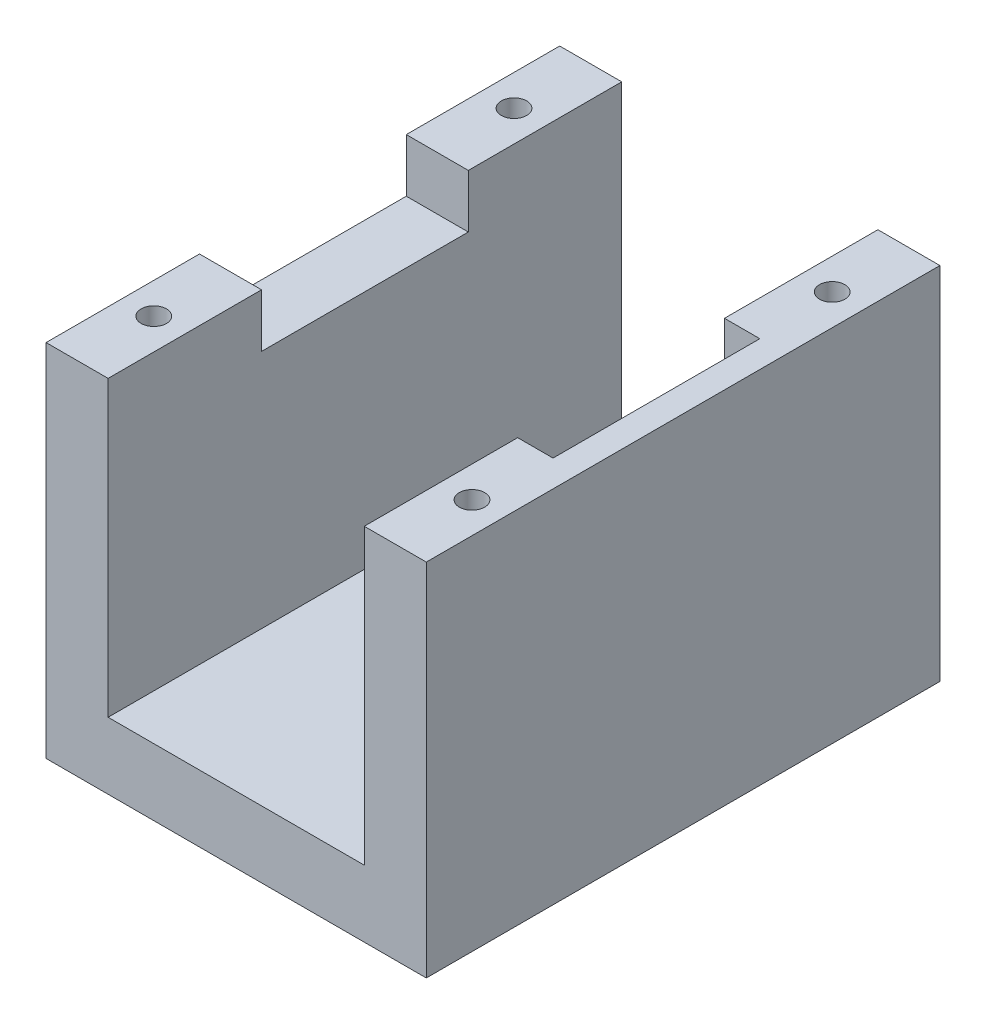
ISO-10303-21;
HEADER;
FILE_DESCRIPTION(('STEP AP214'),'2;1');
FILE_NAME('part.step','',(''),(''),'','','');
FILE_SCHEMA(('AUTOMOTIVE_DESIGN { 1 0 10303 214 1 1 1 1 }'));
ENDSEC;
DATA;
#1=APPLICATION_CONTEXT('core data for automotive mechanical design processes');
#2=APPLICATION_PROTOCOL_DEFINITION('international standard','automotive_design',2000,#1);
#3=PRODUCT_CONTEXT('',#1,'mechanical');
#4=PRODUCT('Part','Part','',(#3));
#5=PRODUCT_RELATED_PRODUCT_CATEGORY('part','',(#4));
#6=PRODUCT_DEFINITION_FORMATION('','',#4);
#7=PRODUCT_DEFINITION_CONTEXT('part definition',#1,'design');
#8=PRODUCT_DEFINITION('design','',#6,#7);
#9=PRODUCT_DEFINITION_SHAPE('','',#8);
#10=(LENGTH_UNIT() NAMED_UNIT(*) SI_UNIT(.MILLI.,.METRE.));
#11=(NAMED_UNIT(*) PLANE_ANGLE_UNIT() SI_UNIT($,.RADIAN.));
#12=(NAMED_UNIT(*) SI_UNIT($,.STERADIAN.) SOLID_ANGLE_UNIT());
#13=UNCERTAINTY_MEASURE_WITH_UNIT(LENGTH_MEASURE(1.E-05),#10,'distance_accuracy_value','');
#14=(GEOMETRIC_REPRESENTATION_CONTEXT(3) GLOBAL_UNCERTAINTY_ASSIGNED_CONTEXT((#13)) GLOBAL_UNIT_ASSIGNED_CONTEXT((#10,
#11,#12)) REPRESENTATION_CONTEXT('',''));
#15=CARTESIAN_POINT('',(0.,0.,0.));
#16=DIRECTION('',(0.,0.,1.));
#17=DIRECTION('',(1.,0.,0.));
#18=AXIS2_PLACEMENT_3D('',#15,#16,#17);
#19=CARTESIAN_POINT('',(0.,44.,0.));
#20=DIRECTION('',(0.,1.,0.));
#21=DIRECTION('',(0.,0.,1.));
#22=AXIS2_PLACEMENT_3D('',#19,#20,#21);
#23=PLANE('',#22);
#24=DIRECTION('',(0.,0.,1.));
#25=VECTOR('',#24,1.);
#26=CARTESIAN_POINT('',(-19.2,44.,38.5));
#27=LINE('',#26,#25);
#28=CARTESIAN_POINT('',(-19.2,44.,15.5));
#29=VERTEX_POINT('',#28);
#30=CARTESIAN_POINT('',(-19.2,44.,38.5));
#31=VERTEX_POINT('',#30);
#32=EDGE_CURVE('E162',#29,#31,#27,.T.);
#33=ORIENTED_EDGE('',*,*,#32,.F.);
#34=DIRECTION('',(1.,0.,0.));
#35=VECTOR('',#34,1.);
#36=CARTESIAN_POINT('',(24.5,44.,15.5));
#37=LINE('',#36,#35);
#38=CARTESIAN_POINT('',(-28.5,44.,15.5));
#39=VERTEX_POINT('',#38);
#40=EDGE_CURVE('E224',#39,#29,#37,.T.);
#41=ORIENTED_EDGE('',*,*,#40,.F.);
#42=DIRECTION('',(0.,0.,1.));
#43=VECTOR('',#42,1.);
#44=CARTESIAN_POINT('',(-28.5,44.,-18.5));
#45=LINE('',#44,#43);
#46=CARTESIAN_POINT('',(-28.5,44.,38.5));
#47=VERTEX_POINT('',#46);
#48=EDGE_CURVE('E171',#39,#47,#45,.T.);
#49=ORIENTED_EDGE('',*,*,#48,.T.);
#50=DIRECTION('',(-1.,0.,0.));
#51=VECTOR('',#50,1.);
#52=CARTESIAN_POINT('',(28.5,44.,38.5));
#53=LINE('',#52,#51);
#54=EDGE_CURVE('E152',#31,#47,#53,.T.);
#55=ORIENTED_EDGE('',*,*,#54,.F.);
#56=EDGE_LOOP('',(#33,#41,#49,#55));
#57=FACE_BOUND('',#56,.T.);
#58=CARTESIAN_POINT('',(-23.85,44.,27.));
#59=DIRECTION('',(0.,1.,0.));
#60=DIRECTION('',(0.,0.,1.));
#61=AXIS2_PLACEMENT_3D('',#58,#59,#60);
#62=CIRCLE('',#61,1.9);
#63=CARTESIAN_POINT('',(-23.85,44.,28.9));
#64=VERTEX_POINT('',#63);
#65=EDGE_CURVE('E274',#64,#64,#62,.T.);
#66=ORIENTED_EDGE('',*,*,#65,.F.);
#67=EDGE_LOOP('',(#66));
#68=FACE_BOUND('',#67,.T.);
#69=ADVANCED_FACE('F37',(#57,#68),#23,.T.);
#70=CARTESIAN_POINT('',(-19.2,44.,-38.5));
#71=VERTEX_POINT('',#70);
#72=CARTESIAN_POINT('',(-19.2,44.,-15.5));
#73=VERTEX_POINT('',#72);
#74=EDGE_CURVE('E52',#71,#73,#27,.T.);
#75=ORIENTED_EDGE('',*,*,#74,.F.);
#76=DIRECTION('',(1.,0.,0.));
#77=VECTOR('',#76,1.);
#78=CARTESIAN_POINT('',(-28.5,44.,-38.5));
#79=LINE('',#78,#77);
#80=CARTESIAN_POINT('',(-28.5,44.,-38.5));
#81=VERTEX_POINT('',#80);
#82=EDGE_CURVE('E190',#81,#71,#79,.T.);
#83=ORIENTED_EDGE('',*,*,#82,.F.);
#84=CARTESIAN_POINT('',(-28.5,44.,-15.5));
#85=VERTEX_POINT('',#84);
#86=EDGE_CURVE('E201',#81,#85,#45,.T.);
#87=ORIENTED_EDGE('',*,*,#86,.T.);
#88=DIRECTION('',(-1.,0.,0.));
#89=VECTOR('',#88,1.);
#90=CARTESIAN_POINT('',(-28.5,44.,-15.5));
#91=LINE('',#90,#89);
#92=EDGE_CURVE('E235',#73,#85,#91,.T.);
#93=ORIENTED_EDGE('',*,*,#92,.F.);
#94=EDGE_LOOP('',(#75,#83,#87,#93));
#95=FACE_BOUND('',#94,.T.);
#96=CARTESIAN_POINT('',(-23.85,44.,-27.));
#97=DIRECTION('',(0.,1.,0.));
#98=DIRECTION('',(0.,0.,1.));
#99=AXIS2_PLACEMENT_3D('',#96,#97,#98);
#100=CIRCLE('',#99,1.9);
#101=CARTESIAN_POINT('',(-23.85,44.,-25.1));
#102=VERTEX_POINT('',#101);
#103=EDGE_CURVE('E280',#102,#102,#100,.T.);
#104=ORIENTED_EDGE('',*,*,#103,.F.);
#105=EDGE_LOOP('',(#104));
#106=FACE_BOUND('',#105,.T.);
#107=ADVANCED_FACE('F328',(#95,#106),#23,.T.);
#108=CARTESIAN_POINT('',(-28.5,36.,-15.5));
#109=DIRECTION('',(0.,0.,-1.));
#110=DIRECTION('',(-1.,0.,0.));
#111=AXIS2_PLACEMENT_3D('',#108,#109,#110);
#112=PLANE('',#111);
#113=DIRECTION('',(-1.,0.,0.));
#114=VECTOR('',#113,1.);
#115=CARTESIAN_POINT('',(-28.5,36.,-15.5));
#116=LINE('',#115,#114);
#117=CARTESIAN_POINT('',(-19.2,36.,-15.5));
#118=VERTEX_POINT('',#117);
#119=CARTESIAN_POINT('',(-28.5,36.,-15.5));
#120=VERTEX_POINT('',#119);
#121=EDGE_CURVE('E297',#118,#120,#116,.T.);
#122=ORIENTED_EDGE('',*,*,#121,.F.);
#123=DIRECTION('',(0.,1.,0.));
#124=VECTOR('',#123,1.);
#125=CARTESIAN_POINT('',(-19.2,36.,-15.5));
#126=LINE('',#125,#124);
#127=EDGE_CURVE('E261',#118,#73,#126,.T.);
#128=ORIENTED_EDGE('',*,*,#127,.T.);
#129=ORIENTED_EDGE('',*,*,#92,.T.);
#130=DIRECTION('',(0.,1.,0.));
#131=VECTOR('',#130,1.);
#132=CARTESIAN_POINT('',(-28.5,36.,-15.5));
#133=LINE('',#132,#131);
#134=EDGE_CURVE('E240',#120,#85,#133,.T.);
#135=ORIENTED_EDGE('',*,*,#134,.F.);
#136=EDGE_LOOP('',(#122,#128,#129,#135));
#137=FACE_BOUND('',#136,.T.);
#138=ADVANCED_FACE('F326',(#137),#112,.F.);
#139=CARTESIAN_POINT('',(24.5,36.,15.5));
#140=DIRECTION('',(0.,0.,1.));
#141=DIRECTION('',(1.,0.,0.));
#142=AXIS2_PLACEMENT_3D('',#139,#140,#141);
#143=PLANE('',#142);
#144=ORIENTED_EDGE('',*,*,#40,.T.);
#145=DIRECTION('',(0.,-1.,0.));
#146=VECTOR('',#145,1.);
#147=CARTESIAN_POINT('',(-19.2,36.,15.5));
#148=LINE('',#147,#146);
#149=CARTESIAN_POINT('',(-19.2,36.,15.5));
#150=VERTEX_POINT('',#149);
#151=EDGE_CURVE('E11',#29,#150,#148,.T.);
#152=ORIENTED_EDGE('',*,*,#151,.T.);
#153=DIRECTION('',(1.,0.,0.));
#154=VECTOR('',#153,1.);
#155=CARTESIAN_POINT('',(24.5,36.,15.5));
#156=LINE('',#155,#154);
#157=CARTESIAN_POINT('',(-28.5,36.,15.5));
#158=VERTEX_POINT('',#157);
#159=EDGE_CURVE('E293',#158,#150,#156,.T.);
#160=ORIENTED_EDGE('',*,*,#159,.F.);
#161=DIRECTION('',(0.,1.,0.));
#162=VECTOR('',#161,1.);
#163=CARTESIAN_POINT('',(-28.5,36.,15.5));
#164=LINE('',#163,#162);
#165=EDGE_CURVE('E248',#158,#39,#164,.T.);
#166=ORIENTED_EDGE('',*,*,#165,.T.);
#167=EDGE_LOOP('',(#144,#152,#160,#166));
#168=FACE_BOUND('',#167,.T.);
#169=ADVANCED_FACE('F324',(#168),#143,.F.);
#170=CARTESIAN_POINT('',(28.5,44.,-18.5));
#171=DIRECTION('',(-1.,0.,0.));
#172=DIRECTION('',(0.,0.,1.));
#173=AXIS2_PLACEMENT_3D('',#170,#171,#172);
#174=PLANE('',#173);
#175=DIRECTION('',(0.,1.,0.));
#176=VECTOR('',#175,1.);
#177=CARTESIAN_POINT('',(28.5,0.,38.5));
#178=LINE('',#177,#176);
#179=CARTESIAN_POINT('',(28.5,-10.,38.5));
#180=VERTEX_POINT('',#179);
#181=CARTESIAN_POINT('',(28.5,44.,38.5));
#182=VERTEX_POINT('',#181);
#183=EDGE_CURVE('E174',#180,#182,#178,.T.);
#184=ORIENTED_EDGE('',*,*,#183,.F.);
#185=DIRECTION('',(0.,0.,1.));
#186=VECTOR('',#185,1.);
#187=CARTESIAN_POINT('',(28.5,-10.,38.5));
#188=LINE('',#187,#186);
#189=CARTESIAN_POINT('',(28.5,-10.,-38.5));
#190=VERTEX_POINT('',#189);
#191=EDGE_CURVE('E364',#190,#180,#188,.T.);
#192=ORIENTED_EDGE('',*,*,#191,.F.);
#193=DIRECTION('',(0.,-1.,0.));
#194=VECTOR('',#193,1.);
#195=CARTESIAN_POINT('',(28.5,44.,-38.5));
#196=LINE('',#195,#194);
#197=CARTESIAN_POINT('',(28.5,44.,-38.5));
#198=VERTEX_POINT('',#197);
#199=EDGE_CURVE('E193',#198,#190,#196,.T.);
#200=ORIENTED_EDGE('',*,*,#199,.F.);
#201=DIRECTION('',(0.,0.,-1.));
#202=VECTOR('',#201,1.);
#203=CARTESIAN_POINT('',(28.5,44.,-18.5));
#204=LINE('',#203,#202);
#205=EDGE_CURVE('E198',#182,#198,#204,.T.);
#206=ORIENTED_EDGE('',*,*,#205,.F.);
#207=EDGE_LOOP('',(#184,#192,#200,#206));
#208=FACE_BOUND('',#207,.T.);
#209=ADVANCED_FACE('F39',(#208),#174,.F.);
#210=CARTESIAN_POINT('',(-28.5,44.,-18.5));
#211=DIRECTION('',(1.,0.,0.));
#212=DIRECTION('',(0.,0.,-1.));
#213=AXIS2_PLACEMENT_3D('',#210,#211,#212);
#214=PLANE('',#213);
#215=DIRECTION('',(0.,0.,1.));
#216=VECTOR('',#215,1.);
#217=CARTESIAN_POINT('',(-28.5,36.,15.5));
#218=LINE('',#217,#216);
#219=EDGE_CURVE('E239',#120,#158,#218,.T.);
#220=ORIENTED_EDGE('',*,*,#219,.F.);
#221=ORIENTED_EDGE('',*,*,#134,.T.);
#222=ORIENTED_EDGE('',*,*,#86,.F.);
#223=DIRECTION('',(0.,1.,0.));
#224=VECTOR('',#223,1.);
#225=CARTESIAN_POINT('',(-28.5,0.,-38.5));
#226=LINE('',#225,#224);
#227=CARTESIAN_POINT('',(-28.5,-10.,-38.5));
#228=VERTEX_POINT('',#227);
#229=EDGE_CURVE('E186',#228,#81,#226,.T.);
#230=ORIENTED_EDGE('',*,*,#229,.F.);
#231=DIRECTION('',(0.,0.,-1.));
#232=VECTOR('',#231,1.);
#233=CARTESIAN_POINT('',(-28.5,-10.,-38.5));
#234=LINE('',#233,#232);
#235=CARTESIAN_POINT('',(-28.5,-10.,38.5));
#236=VERTEX_POINT('',#235);
#237=EDGE_CURVE('E263',#236,#228,#234,.T.);
#238=ORIENTED_EDGE('',*,*,#237,.F.);
#239=DIRECTION('',(0.,-1.,0.));
#240=VECTOR('',#239,1.);
#241=CARTESIAN_POINT('',(-28.5,44.,38.5));
#242=LINE('',#241,#240);
#243=EDGE_CURVE('E159',#47,#236,#242,.T.);
#244=ORIENTED_EDGE('',*,*,#243,.F.);
#245=ORIENTED_EDGE('',*,*,#48,.F.);
#246=ORIENTED_EDGE('',*,*,#165,.F.);
#247=EDGE_LOOP('',(#220,#221,#222,#230,#238,#244,#245,#246));
#248=FACE_BOUND('',#247,.T.);
#249=ADVANCED_FACE('F336',(#248),#214,.F.);
#250=DIRECTION('',(0.,0.,-1.));
#251=VECTOR('',#250,1.);
#252=CARTESIAN_POINT('',(19.2,44.,-38.5));
#253=LINE('',#252,#251);
#254=CARTESIAN_POINT('',(19.2,44.,38.5));
#255=VERTEX_POINT('',#254);
#256=CARTESIAN_POINT('',(19.2,44.,15.5));
#257=VERTEX_POINT('',#256);
#258=EDGE_CURVE('E60',#255,#257,#253,.T.);
#259=ORIENTED_EDGE('',*,*,#258,.F.);
#260=EDGE_CURVE('E173',#182,#255,#53,.T.);
#261=ORIENTED_EDGE('',*,*,#260,.F.);
#262=ORIENTED_EDGE('',*,*,#205,.T.);
#263=CARTESIAN_POINT('',(19.2,44.,-38.5));
#264=VERTEX_POINT('',#263);
#265=EDGE_CURVE('E189',#264,#198,#79,.T.);
#266=ORIENTED_EDGE('',*,*,#265,.F.);
#267=CARTESIAN_POINT('',(19.2,44.,-15.5));
#268=VERTEX_POINT('',#267);
#269=EDGE_CURVE('E309',#268,#264,#253,.T.);
#270=ORIENTED_EDGE('',*,*,#269,.F.);
#271=CARTESIAN_POINT('',(24.5,44.,-15.5));
#272=VERTEX_POINT('',#271);
#273=EDGE_CURVE('E236',#272,#268,#91,.T.);
#274=ORIENTED_EDGE('',*,*,#273,.F.);
#275=DIRECTION('',(0.,0.,-1.));
#276=VECTOR('',#275,1.);
#277=CARTESIAN_POINT('',(24.5,44.,-15.5));
#278=LINE('',#277,#276);
#279=CARTESIAN_POINT('',(24.5,44.,15.5));
#280=VERTEX_POINT('',#279);
#281=EDGE_CURVE('E223',#280,#272,#278,.T.);
#282=ORIENTED_EDGE('',*,*,#281,.F.);
#283=EDGE_CURVE('E212',#257,#280,#37,.T.);
#284=ORIENTED_EDGE('',*,*,#283,.F.);
#285=EDGE_LOOP('',(#259,#261,#262,#266,#270,#274,#282,#284));
#286=FACE_BOUND('',#285,.T.);
#287=CARTESIAN_POINT('',(23.85,44.,-27.));
#288=DIRECTION('',(0.,1.,0.));
#289=DIRECTION('',(0.,0.,1.));
#290=AXIS2_PLACEMENT_3D('',#287,#288,#289);
#291=CIRCLE('',#290,1.9);
#292=CARTESIAN_POINT('',(23.85,44.,-25.1));
#293=VERTEX_POINT('',#292);
#294=EDGE_CURVE('E286',#293,#293,#291,.T.);
#295=ORIENTED_EDGE('',*,*,#294,.F.);
#296=EDGE_LOOP('',(#295));
#297=FACE_BOUND('',#296,.T.);
#298=CARTESIAN_POINT('',(23.85,44.,27.));
#299=DIRECTION('',(0.,1.,0.));
#300=DIRECTION('',(0.,0.,1.));
#301=AXIS2_PLACEMENT_3D('',#298,#299,#300);
#302=CIRCLE('',#301,1.9);
#303=CARTESIAN_POINT('',(23.85,44.,28.9));
#304=VERTEX_POINT('',#303);
#305=EDGE_CURVE('E228',#304,#304,#302,.T.);
#306=ORIENTED_EDGE('',*,*,#305,.F.);
#307=EDGE_LOOP('',(#306));
#308=FACE_BOUND('',#307,.T.);
#309=ADVANCED_FACE('F218',(#286,#297,#308),#23,.T.);
#310=CARTESIAN_POINT('',(-19.2,0.,-28.5));
#311=DIRECTION('',(-1.,0.,0.));
#312=DIRECTION('',(0.,0.,1.));
#313=AXIS2_PLACEMENT_3D('',#310,#311,#312);
#314=PLANE('',#313);
#315=DIRECTION('',(0.,-1.,0.));
#316=VECTOR('',#315,1.);
#317=CARTESIAN_POINT('',(-19.2,36.,-38.5));
#318=LINE('',#317,#316);
#319=CARTESIAN_POINT('',(-19.2,0.,-38.5));
#320=VERTEX_POINT('',#319);
#321=EDGE_CURVE('E183',#71,#320,#318,.T.);
#322=ORIENTED_EDGE('',*,*,#321,.F.);
#323=ORIENTED_EDGE('',*,*,#74,.T.);
#324=ORIENTED_EDGE('',*,*,#127,.F.);
#325=DIRECTION('',(0.,0.,1.));
#326=VECTOR('',#325,1.);
#327=CARTESIAN_POINT('',(-19.2,36.,-28.5));
#328=LINE('',#327,#326);
#329=EDGE_CURVE('E243',#118,#150,#328,.T.);
#330=ORIENTED_EDGE('',*,*,#329,.T.);
#331=ORIENTED_EDGE('',*,*,#151,.F.);
#332=ORIENTED_EDGE('',*,*,#32,.T.);
#333=DIRECTION('',(0.,1.,0.));
#334=VECTOR('',#333,1.);
#335=CARTESIAN_POINT('',(-19.2,0.,38.5));
#336=LINE('',#335,#334);
#337=CARTESIAN_POINT('',(-19.2,0.,38.5));
#338=VERTEX_POINT('',#337);
#339=EDGE_CURVE('E148',#338,#31,#336,.T.);
#340=ORIENTED_EDGE('',*,*,#339,.F.);
#341=DIRECTION('',(0.,0.,1.));
#342=VECTOR('',#341,1.);
#343=CARTESIAN_POINT('',(-19.2,0.,0.));
#344=LINE('',#343,#342);
#345=EDGE_CURVE('E206',#320,#338,#344,.T.);
#346=ORIENTED_EDGE('',*,*,#345,.F.);
#347=EDGE_LOOP('',(#322,#323,#324,#330,#331,#332,#340,#346));
#348=FACE_BOUND('',#347,.T.);
#349=ADVANCED_FACE('F163',(#348),#314,.F.);
#350=CARTESIAN_POINT('',(19.2,36.,-28.5));
#351=DIRECTION('',(1.,0.,0.));
#352=DIRECTION('',(0.,1.,0.));
#353=AXIS2_PLACEMENT_3D('',#350,#351,#352);
#354=PLANE('',#353);
#355=DIRECTION('',(0.,0.,-1.));
#356=VECTOR('',#355,1.);
#357=CARTESIAN_POINT('',(19.2,0.,0.));
#358=LINE('',#357,#356);
#359=CARTESIAN_POINT('',(19.2,0.,38.5));
#360=VERTEX_POINT('',#359);
#361=CARTESIAN_POINT('',(19.2,0.,-38.5));
#362=VERTEX_POINT('',#361);
#363=EDGE_CURVE('E204',#360,#362,#358,.T.);
#364=ORIENTED_EDGE('',*,*,#363,.F.);
#365=DIRECTION('',(0.,-1.,0.));
#366=VECTOR('',#365,1.);
#367=CARTESIAN_POINT('',(19.2,36.,38.5));
#368=LINE('',#367,#366);
#369=EDGE_CURVE('E158',#255,#360,#368,.T.);
#370=ORIENTED_EDGE('',*,*,#369,.F.);
#371=ORIENTED_EDGE('',*,*,#258,.T.);
#372=DIRECTION('',(0.,1.,0.));
#373=VECTOR('',#372,1.);
#374=CARTESIAN_POINT('',(19.2,36.,15.5));
#375=LINE('',#374,#373);
#376=CARTESIAN_POINT('',(19.2,36.,15.5));
#377=VERTEX_POINT('',#376);
#378=EDGE_CURVE('E45',#377,#257,#375,.T.);
#379=ORIENTED_EDGE('',*,*,#378,.F.);
#380=DIRECTION('',(0.,0.,1.));
#381=VECTOR('',#380,1.);
#382=CARTESIAN_POINT('',(19.2,36.,-28.5));
#383=LINE('',#382,#381);
#384=CARTESIAN_POINT('',(19.2,36.,-15.5));
#385=VERTEX_POINT('',#384);
#386=EDGE_CURVE('E195',#385,#377,#383,.T.);
#387=ORIENTED_EDGE('',*,*,#386,.F.);
#388=DIRECTION('',(0.,-1.,0.));
#389=VECTOR('',#388,1.);
#390=CARTESIAN_POINT('',(19.2,36.,-15.5));
#391=LINE('',#390,#389);
#392=EDGE_CURVE('E265',#268,#385,#391,.T.);
#393=ORIENTED_EDGE('',*,*,#392,.F.);
#394=ORIENTED_EDGE('',*,*,#269,.T.);
#395=DIRECTION('',(0.,1.,0.));
#396=VECTOR('',#395,1.);
#397=CARTESIAN_POINT('',(19.2,0.,-38.5));
#398=LINE('',#397,#396);
#399=EDGE_CURVE('E177',#362,#264,#398,.T.);
#400=ORIENTED_EDGE('',*,*,#399,.F.);
#401=EDGE_LOOP('',(#364,#370,#371,#379,#387,#393,#394,#400));
#402=FACE_BOUND('',#401,.T.);
#403=ADVANCED_FACE('F252',(#402),#354,.F.);
#404=CARTESIAN_POINT('',(0.,0.,-38.5));
#405=DIRECTION('',(0.,0.,1.));
#406=DIRECTION('',(1.,0.,0.));
#407=AXIS2_PLACEMENT_3D('',#404,#405,#406);
#408=PLANE('',#407);
#409=ORIENTED_EDGE('',*,*,#82,.T.);
#410=ORIENTED_EDGE('',*,*,#321,.T.);
#411=DIRECTION('',(1.,0.,0.));
#412=VECTOR('',#411,1.);
#413=CARTESIAN_POINT('',(28.5,0.,-38.5));
#414=LINE('',#413,#412);
#415=EDGE_CURVE('E258',#320,#362,#414,.T.);
#416=ORIENTED_EDGE('',*,*,#415,.T.);
#417=ORIENTED_EDGE('',*,*,#399,.T.);
#418=ORIENTED_EDGE('',*,*,#265,.T.);
#419=ORIENTED_EDGE('',*,*,#199,.T.);
#420=DIRECTION('',(1.,0.,0.));
#421=VECTOR('',#420,1.);
#422=CARTESIAN_POINT('',(28.5,-10.,-38.5));
#423=LINE('',#422,#421);
#424=EDGE_CURVE('E358',#228,#190,#423,.T.);
#425=ORIENTED_EDGE('',*,*,#424,.F.);
#426=ORIENTED_EDGE('',*,*,#229,.T.);
#427=EDGE_LOOP('',(#409,#410,#416,#417,#418,#419,#425,#426));
#428=FACE_BOUND('',#427,.T.);
#429=ADVANCED_FACE('F260',(#428),#408,.F.);
#430=CARTESIAN_POINT('',(0.,0.,38.5));
#431=DIRECTION('',(0.,0.,1.));
#432=DIRECTION('',(1.,0.,0.));
#433=AXIS2_PLACEMENT_3D('',#430,#431,#432);
#434=PLANE('',#433);
#435=ORIENTED_EDGE('',*,*,#339,.T.);
#436=ORIENTED_EDGE('',*,*,#54,.T.);
#437=ORIENTED_EDGE('',*,*,#243,.T.);
#438=DIRECTION('',(-1.,0.,0.));
#439=VECTOR('',#438,1.);
#440=CARTESIAN_POINT('',(-28.5,-10.,38.5));
#441=LINE('',#440,#439);
#442=EDGE_CURVE('E268',#180,#236,#441,.T.);
#443=ORIENTED_EDGE('',*,*,#442,.F.);
#444=ORIENTED_EDGE('',*,*,#183,.T.);
#445=ORIENTED_EDGE('',*,*,#260,.T.);
#446=ORIENTED_EDGE('',*,*,#369,.T.);
#447=DIRECTION('',(-1.,0.,0.));
#448=VECTOR('',#447,1.);
#449=CARTESIAN_POINT('',(-28.5,0.,38.5));
#450=LINE('',#449,#448);
#451=EDGE_CURVE('E155',#360,#338,#450,.T.);
#452=ORIENTED_EDGE('',*,*,#451,.T.);
#453=EDGE_LOOP('',(#435,#436,#437,#443,#444,#445,#446,#452));
#454=FACE_BOUND('',#453,.T.);
#455=ADVANCED_FACE('F150',(#454),#434,.T.);
#456=CARTESIAN_POINT('',(0.,36.,0.));
#457=DIRECTION('',(0.,-1.,0.));
#458=DIRECTION('',(0.,0.,-1.));
#459=AXIS2_PLACEMENT_3D('',#456,#457,#458);
#460=PLANE('',#459);
#461=ORIENTED_EDGE('',*,*,#121,.T.);
#462=ORIENTED_EDGE('',*,*,#219,.T.);
#463=ORIENTED_EDGE('',*,*,#159,.T.);
#464=ORIENTED_EDGE('',*,*,#329,.F.);
#465=EDGE_LOOP('',(#461,#462,#463,#464));
#466=FACE_BOUND('',#465,.T.);
#467=ADVANCED_FACE('F349',(#466),#460,.F.);
#468=CARTESIAN_POINT('',(24.5,36.,15.5));
#469=VERTEX_POINT('',#468);
#470=EDGE_CURVE('E214',#377,#469,#156,.T.);
#471=ORIENTED_EDGE('',*,*,#470,.T.);
#472=DIRECTION('',(0.,0.,-1.));
#473=VECTOR('',#472,1.);
#474=CARTESIAN_POINT('',(24.5,36.,-15.5));
#475=LINE('',#474,#473);
#476=CARTESIAN_POINT('',(24.5,36.,-15.5));
#477=VERTEX_POINT('',#476);
#478=EDGE_CURVE('E295',#469,#477,#475,.T.);
#479=ORIENTED_EDGE('',*,*,#478,.T.);
#480=EDGE_CURVE('E232',#477,#385,#116,.T.);
#481=ORIENTED_EDGE('',*,*,#480,.T.);
#482=ORIENTED_EDGE('',*,*,#386,.T.);
#483=EDGE_LOOP('',(#471,#479,#481,#482));
#484=FACE_BOUND('',#483,.T.);
#485=ADVANCED_FACE('F306',(#484),#460,.F.);
#486=ORIENTED_EDGE('',*,*,#273,.T.);
#487=ORIENTED_EDGE('',*,*,#392,.T.);
#488=ORIENTED_EDGE('',*,*,#480,.F.);
#489=DIRECTION('',(0.,1.,0.));
#490=VECTOR('',#489,1.);
#491=CARTESIAN_POINT('',(24.5,36.,-15.5));
#492=LINE('',#491,#490);
#493=EDGE_CURVE('E244',#477,#272,#492,.T.);
#494=ORIENTED_EDGE('',*,*,#493,.T.);
#495=EDGE_LOOP('',(#486,#487,#488,#494));
#496=FACE_BOUND('',#495,.T.);
#497=ADVANCED_FACE('F313',(#496),#112,.F.);
#498=CARTESIAN_POINT('',(24.5,36.,-15.5));
#499=DIRECTION('',(1.,0.,0.));
#500=DIRECTION('',(0.,0.,-1.));
#501=AXIS2_PLACEMENT_3D('',#498,#499,#500);
#502=PLANE('',#501);
#503=ORIENTED_EDGE('',*,*,#281,.T.);
#504=ORIENTED_EDGE('',*,*,#493,.F.);
#505=ORIENTED_EDGE('',*,*,#478,.F.);
#506=DIRECTION('',(0.,1.,0.));
#507=VECTOR('',#506,1.);
#508=CARTESIAN_POINT('',(24.5,36.,15.5));
#509=LINE('',#508,#507);
#510=EDGE_CURVE('E246',#469,#280,#509,.T.);
#511=ORIENTED_EDGE('',*,*,#510,.T.);
#512=EDGE_LOOP('',(#503,#504,#505,#511));
#513=FACE_BOUND('',#512,.T.);
#514=ADVANCED_FACE('F315',(#513),#502,.F.);
#515=ORIENTED_EDGE('',*,*,#470,.F.);
#516=ORIENTED_EDGE('',*,*,#378,.T.);
#517=ORIENTED_EDGE('',*,*,#283,.T.);
#518=ORIENTED_EDGE('',*,*,#510,.F.);
#519=EDGE_LOOP('',(#515,#516,#517,#518));
#520=FACE_BOUND('',#519,.T.);
#521=ADVANCED_FACE('F210',(#520),#143,.F.);
#522=CARTESIAN_POINT('',(23.85,4.,27.));
#523=DIRECTION('',(0.,1.,0.));
#524=DIRECTION('',(0.,0.,1.));
#525=AXIS2_PLACEMENT_3D('',#522,#523,#524);
#526=CYLINDRICAL_SURFACE('',#525,1.9);
#527=CARTESIAN_POINT('',(23.85,4.,27.));
#528=DIRECTION('',(0.,1.,0.));
#529=DIRECTION('',(0.,0.,1.));
#530=AXIS2_PLACEMENT_3D('',#527,#528,#529);
#531=CIRCLE('',#530,1.9);
#532=CARTESIAN_POINT('',(23.85,4.,28.9));
#533=VERTEX_POINT('',#532);
#534=EDGE_CURVE('E225',#533,#533,#531,.T.);
#535=ORIENTED_EDGE('',*,*,#534,.F.);
#536=EDGE_LOOP('',(#535));
#537=FACE_BOUND('',#536,.T.);
#538=ORIENTED_EDGE('',*,*,#305,.T.);
#539=EDGE_LOOP('',(#538));
#540=FACE_BOUND('',#539,.T.);
#541=ADVANCED_FACE('F322',(#537,#540),#526,.F.);
#542=CARTESIAN_POINT('',(0.,4.,0.));
#543=DIRECTION('',(0.,1.,0.));
#544=DIRECTION('',(0.,0.,1.));
#545=AXIS2_PLACEMENT_3D('',#542,#543,#544);
#546=PLANE('',#545);
#547=ORIENTED_EDGE('',*,*,#534,.T.);
#548=EDGE_LOOP('',(#547));
#549=FACE_BOUND('',#548,.T.);
#550=ADVANCED_FACE('F386',(#549),#546,.T.);
#551=CARTESIAN_POINT('',(-23.85,4.,27.));
#552=DIRECTION('',(0.,1.,0.));
#553=DIRECTION('',(0.,0.,1.));
#554=AXIS2_PLACEMENT_3D('',#551,#552,#553);
#555=CYLINDRICAL_SURFACE('',#554,1.9);
#556=CARTESIAN_POINT('',(-23.85,4.,27.));
#557=DIRECTION('',(0.,1.,0.));
#558=DIRECTION('',(0.,0.,1.));
#559=AXIS2_PLACEMENT_3D('',#556,#557,#558);
#560=CIRCLE('',#559,1.9);
#561=CARTESIAN_POINT('',(-23.85,4.,28.9));
#562=VERTEX_POINT('',#561);
#563=EDGE_CURVE('E271',#562,#562,#560,.T.);
#564=ORIENTED_EDGE('',*,*,#563,.F.);
#565=EDGE_LOOP('',(#564));
#566=FACE_BOUND('',#565,.T.);
#567=ORIENTED_EDGE('',*,*,#65,.T.);
#568=EDGE_LOOP('',(#567));
#569=FACE_BOUND('',#568,.T.);
#570=ADVANCED_FACE('F382',(#566,#569),#555,.F.);
#571=CARTESIAN_POINT('',(0.,4.,0.));
#572=DIRECTION('',(0.,1.,0.));
#573=DIRECTION('',(0.,0.,1.));
#574=AXIS2_PLACEMENT_3D('',#571,#572,#573);
#575=PLANE('',#574);
#576=ORIENTED_EDGE('',*,*,#563,.T.);
#577=EDGE_LOOP('',(#576));
#578=FACE_BOUND('',#577,.T.);
#579=ADVANCED_FACE('F378',(#578),#575,.T.);
#580=CARTESIAN_POINT('',(-23.85,4.,-27.));
#581=DIRECTION('',(0.,1.,0.));
#582=DIRECTION('',(0.,0.,1.));
#583=AXIS2_PLACEMENT_3D('',#580,#581,#582);
#584=CYLINDRICAL_SURFACE('',#583,1.9);
#585=CARTESIAN_POINT('',(-23.85,4.,-27.));
#586=DIRECTION('',(0.,1.,0.));
#587=DIRECTION('',(0.,0.,1.));
#588=AXIS2_PLACEMENT_3D('',#585,#586,#587);
#589=CIRCLE('',#588,1.9);
#590=CARTESIAN_POINT('',(-23.85,4.,-25.1));
#591=VERTEX_POINT('',#590);
#592=EDGE_CURVE('E277',#591,#591,#589,.T.);
#593=ORIENTED_EDGE('',*,*,#592,.F.);
#594=EDGE_LOOP('',(#593));
#595=FACE_BOUND('',#594,.T.);
#596=ORIENTED_EDGE('',*,*,#103,.T.);
#597=EDGE_LOOP('',(#596));
#598=FACE_BOUND('',#597,.T.);
#599=ADVANCED_FACE('F381',(#595,#598),#584,.F.);
#600=CARTESIAN_POINT('',(0.,4.,0.));
#601=DIRECTION('',(0.,1.,0.));
#602=DIRECTION('',(0.,0.,1.));
#603=AXIS2_PLACEMENT_3D('',#600,#601,#602);
#604=PLANE('',#603);
#605=ORIENTED_EDGE('',*,*,#592,.T.);
#606=EDGE_LOOP('',(#605));
#607=FACE_BOUND('',#606,.T.);
#608=ADVANCED_FACE('F388',(#607),#604,.T.);
#609=CARTESIAN_POINT('',(23.85,4.,-27.));
#610=DIRECTION('',(0.,1.,0.));
#611=DIRECTION('',(0.,0.,1.));
#612=AXIS2_PLACEMENT_3D('',#609,#610,#611);
#613=CYLINDRICAL_SURFACE('',#612,1.9);
#614=CARTESIAN_POINT('',(23.85,4.,-27.));
#615=DIRECTION('',(0.,1.,0.));
#616=DIRECTION('',(0.,0.,1.));
#617=AXIS2_PLACEMENT_3D('',#614,#615,#616);
#618=CIRCLE('',#617,1.9);
#619=CARTESIAN_POINT('',(23.85,4.,-25.1));
#620=VERTEX_POINT('',#619);
#621=EDGE_CURVE('E283',#620,#620,#618,.T.);
#622=ORIENTED_EDGE('',*,*,#621,.F.);
#623=EDGE_LOOP('',(#622));
#624=FACE_BOUND('',#623,.T.);
#625=ORIENTED_EDGE('',*,*,#294,.T.);
#626=EDGE_LOOP('',(#625));
#627=FACE_BOUND('',#626,.T.);
#628=ADVANCED_FACE('F391',(#624,#627),#613,.F.);
#629=CARTESIAN_POINT('',(0.,4.,0.));
#630=DIRECTION('',(0.,1.,0.));
#631=DIRECTION('',(0.,0.,1.));
#632=AXIS2_PLACEMENT_3D('',#629,#630,#631);
#633=PLANE('',#632);
#634=ORIENTED_EDGE('',*,*,#621,.T.);
#635=EDGE_LOOP('',(#634));
#636=FACE_BOUND('',#635,.T.);
#637=ADVANCED_FACE('F375',(#636),#633,.T.);
#638=CARTESIAN_POINT('',(0.,0.,0.));
#639=DIRECTION('',(0.,1.,0.));
#640=DIRECTION('',(0.,0.,1.));
#641=AXIS2_PLACEMENT_3D('',#638,#639,#640);
#642=PLANE('',#641);
#643=ORIENTED_EDGE('',*,*,#345,.T.);
#644=ORIENTED_EDGE('',*,*,#451,.F.);
#645=ORIENTED_EDGE('',*,*,#363,.T.);
#646=ORIENTED_EDGE('',*,*,#415,.F.);
#647=EDGE_LOOP('',(#643,#644,#645,#646));
#648=FACE_BOUND('',#647,.T.);
#649=ADVANCED_FACE('F257',(#648),#642,.T.);
#650=CARTESIAN_POINT('',(0.,-10.,0.));
#651=DIRECTION('',(0.,1.,0.));
#652=DIRECTION('',(0.,0.,1.));
#653=AXIS2_PLACEMENT_3D('',#650,#651,#652);
#654=PLANE('',#653);
#655=ORIENTED_EDGE('',*,*,#237,.T.);
#656=ORIENTED_EDGE('',*,*,#424,.T.);
#657=ORIENTED_EDGE('',*,*,#191,.T.);
#658=ORIENTED_EDGE('',*,*,#442,.T.);
#659=EDGE_LOOP('',(#655,#656,#657,#658));
#660=FACE_BOUND('',#659,.T.);
#661=ADVANCED_FACE('F367',(#660),#654,.F.);
#662=CLOSED_SHELL('',(#69,#107,#138,#169,#209,#249,#309,#349,#403,#429,#455,#467,#485,#497,#514,
#521,#541,#550,#570,#579,#599,#608,#628,#637,#649,#661));
#663=MANIFOLD_SOLID_BREP('B2',#662);
#664=ADVANCED_BREP_SHAPE_REPRESENTATION('',(#18,#663),#14);
#665=SHAPE_DEFINITION_REPRESENTATION(#9,#664);
ENDSEC;
END-ISO-10303-21;
